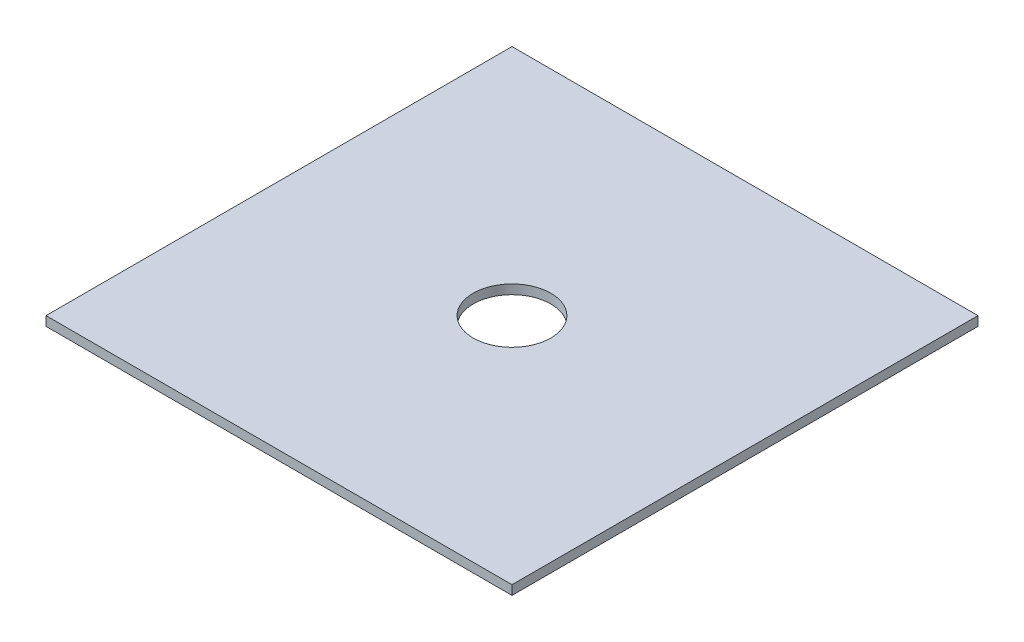
ISO-10303-21;
HEADER;
FILE_DESCRIPTION(('STEP AP214'),'2;1');
FILE_NAME('part.step','',(''),(''),'','','');
FILE_SCHEMA(('AUTOMOTIVE_DESIGN { 1 0 10303 214 1 1 1 1 }'));
ENDSEC;
DATA;
#1=APPLICATION_CONTEXT('core data for automotive mechanical design processes');
#2=APPLICATION_PROTOCOL_DEFINITION('international standard','automotive_design',2000,#1);
#3=PRODUCT_CONTEXT('',#1,'mechanical');
#4=PRODUCT('Part','Part','',(#3));
#5=PRODUCT_RELATED_PRODUCT_CATEGORY('part','',(#4));
#6=PRODUCT_DEFINITION_FORMATION('','',#4);
#7=PRODUCT_DEFINITION_CONTEXT('part definition',#1,'design');
#8=PRODUCT_DEFINITION('design','',#6,#7);
#9=PRODUCT_DEFINITION_SHAPE('','',#8);
#10=(LENGTH_UNIT() NAMED_UNIT(*) SI_UNIT(.MILLI.,.METRE.));
#11=(NAMED_UNIT(*) PLANE_ANGLE_UNIT() SI_UNIT($,.RADIAN.));
#12=(NAMED_UNIT(*) SI_UNIT($,.STERADIAN.) SOLID_ANGLE_UNIT());
#13=UNCERTAINTY_MEASURE_WITH_UNIT(LENGTH_MEASURE(1.E-05),#10,'distance_accuracy_value','');
#14=(GEOMETRIC_REPRESENTATION_CONTEXT(3) GLOBAL_UNCERTAINTY_ASSIGNED_CONTEXT((#13)) GLOBAL_UNIT_ASSIGNED_CONTEXT((#10,
#11,#12)) REPRESENTATION_CONTEXT('',''));
#15=CARTESIAN_POINT('',(0.,0.,0.));
#16=DIRECTION('',(0.,0.,1.));
#17=DIRECTION('',(1.,0.,0.));
#18=AXIS2_PLACEMENT_3D('',#15,#16,#17);
#19=CARTESIAN_POINT('',(75.,3.,75.));
#20=DIRECTION('',(-1.,0.,0.));
#21=DIRECTION('',(0.,0.,1.));
#22=AXIS2_PLACEMENT_3D('',#19,#20,#21);
#23=PLANE('',#22);
#24=DIRECTION('',(0.,0.,-1.));
#25=VECTOR('',#24,1.);
#26=CARTESIAN_POINT('',(75.,0.,75.));
#27=LINE('',#26,#25);
#28=CARTESIAN_POINT('',(75.,0.,75.));
#29=VERTEX_POINT('',#28);
#30=CARTESIAN_POINT('',(75.,0.,-75.));
#31=VERTEX_POINT('',#30);
#32=EDGE_CURVE('E96',#29,#31,#27,.T.);
#33=ORIENTED_EDGE('',*,*,#32,.T.);
#34=DIRECTION('',(0.,-1.,0.));
#35=VECTOR('',#34,1.);
#36=CARTESIAN_POINT('',(75.,3.,-75.));
#37=LINE('',#36,#35);
#38=CARTESIAN_POINT('',(75.,3.,-75.));
#39=VERTEX_POINT('',#38);
#40=EDGE_CURVE('E11',#39,#31,#37,.T.);
#41=ORIENTED_EDGE('',*,*,#40,.F.);
#42=DIRECTION('',(0.,0.,-1.));
#43=VECTOR('',#42,1.);
#44=CARTESIAN_POINT('',(75.,3.,75.));
#45=LINE('',#44,#43);
#46=CARTESIAN_POINT('',(75.,3.,75.));
#47=VERTEX_POINT('',#46);
#48=EDGE_CURVE('E84',#47,#39,#45,.T.);
#49=ORIENTED_EDGE('',*,*,#48,.F.);
#50=DIRECTION('',(0.,-1.,0.));
#51=VECTOR('',#50,1.);
#52=CARTESIAN_POINT('',(75.,3.,75.));
#53=LINE('',#52,#51);
#54=EDGE_CURVE('E92',#47,#29,#53,.T.);
#55=ORIENTED_EDGE('',*,*,#54,.T.);
#56=EDGE_LOOP('',(#33,#41,#49,#55));
#57=FACE_BOUND('',#56,.T.);
#58=ADVANCED_FACE('F33',(#57),#23,.F.);
#59=CARTESIAN_POINT('',(-75.,3.,-75.));
#60=DIRECTION('',(0.,0.,1.));
#61=DIRECTION('',(1.,0.,0.));
#62=AXIS2_PLACEMENT_3D('',#59,#60,#61);
#63=PLANE('',#62);
#64=DIRECTION('',(-1.,0.,0.));
#65=VECTOR('',#64,1.);
#66=CARTESIAN_POINT('',(-75.,0.,-75.));
#67=LINE('',#66,#65);
#68=CARTESIAN_POINT('',(-75.,0.,-75.));
#69=VERTEX_POINT('',#68);
#70=EDGE_CURVE('E88',#31,#69,#67,.T.);
#71=ORIENTED_EDGE('',*,*,#70,.T.);
#72=DIRECTION('',(0.,-1.,0.));
#73=VECTOR('',#72,1.);
#74=CARTESIAN_POINT('',(-75.,3.,-75.));
#75=LINE('',#74,#73);
#76=CARTESIAN_POINT('',(-75.,3.,-75.));
#77=VERTEX_POINT('',#76);
#78=EDGE_CURVE('E41',#77,#69,#75,.T.);
#79=ORIENTED_EDGE('',*,*,#78,.F.);
#80=DIRECTION('',(-1.,0.,0.));
#81=VECTOR('',#80,1.);
#82=CARTESIAN_POINT('',(-75.,3.,-75.));
#83=LINE('',#82,#81);
#84=EDGE_CURVE('E79',#39,#77,#83,.T.);
#85=ORIENTED_EDGE('',*,*,#84,.F.);
#86=ORIENTED_EDGE('',*,*,#40,.T.);
#87=EDGE_LOOP('',(#71,#79,#85,#86));
#88=FACE_BOUND('',#87,.T.);
#89=ADVANCED_FACE('F87',(#88),#63,.F.);
#90=CARTESIAN_POINT('',(-75.,3.,75.));
#91=DIRECTION('',(1.,0.,0.));
#92=DIRECTION('',(0.,0.,-1.));
#93=AXIS2_PLACEMENT_3D('',#90,#91,#92);
#94=PLANE('',#93);
#95=DIRECTION('',(0.,0.,1.));
#96=VECTOR('',#95,1.);
#97=CARTESIAN_POINT('',(-75.,0.,75.));
#98=LINE('',#97,#96);
#99=CARTESIAN_POINT('',(-75.,0.,75.));
#100=VERTEX_POINT('',#99);
#101=EDGE_CURVE('E66',#69,#100,#98,.T.);
#102=ORIENTED_EDGE('',*,*,#101,.T.);
#103=DIRECTION('',(0.,-1.,0.));
#104=VECTOR('',#103,1.);
#105=CARTESIAN_POINT('',(-75.,3.,75.));
#106=LINE('',#105,#104);
#107=CARTESIAN_POINT('',(-75.,3.,75.));
#108=VERTEX_POINT('',#107);
#109=EDGE_CURVE('E89',#108,#100,#106,.T.);
#110=ORIENTED_EDGE('',*,*,#109,.F.);
#111=DIRECTION('',(0.,0.,1.));
#112=VECTOR('',#111,1.);
#113=CARTESIAN_POINT('',(-75.,3.,75.));
#114=LINE('',#113,#112);
#115=EDGE_CURVE('E82',#77,#108,#114,.T.);
#116=ORIENTED_EDGE('',*,*,#115,.F.);
#117=ORIENTED_EDGE('',*,*,#78,.T.);
#118=EDGE_LOOP('',(#102,#110,#116,#117));
#119=FACE_BOUND('',#118,.T.);
#120=ADVANCED_FACE('F90',(#119),#94,.F.);
#121=CARTESIAN_POINT('',(-75.,3.,75.));
#122=DIRECTION('',(0.,0.,-1.));
#123=DIRECTION('',(-1.,0.,0.));
#124=AXIS2_PLACEMENT_3D('',#121,#122,#123);
#125=PLANE('',#124);
#126=DIRECTION('',(1.,0.,0.));
#127=VECTOR('',#126,1.);
#128=CARTESIAN_POINT('',(-75.,0.,75.));
#129=LINE('',#128,#127);
#130=EDGE_CURVE('E72',#100,#29,#129,.T.);
#131=ORIENTED_EDGE('',*,*,#130,.T.);
#132=ORIENTED_EDGE('',*,*,#54,.F.);
#133=DIRECTION('',(1.,0.,0.));
#134=VECTOR('',#133,1.);
#135=CARTESIAN_POINT('',(-75.,3.,75.));
#136=LINE('',#135,#134);
#137=EDGE_CURVE('E49',#108,#47,#136,.T.);
#138=ORIENTED_EDGE('',*,*,#137,.F.);
#139=ORIENTED_EDGE('',*,*,#109,.T.);
#140=EDGE_LOOP('',(#131,#132,#138,#139));
#141=FACE_BOUND('',#140,.T.);
#142=ADVANCED_FACE('F104',(#141),#125,.F.);
#143=CARTESIAN_POINT('',(0.,3.,0.));
#144=DIRECTION('',(0.,-1.,0.));
#145=DIRECTION('',(0.,0.,-1.));
#146=AXIS2_PLACEMENT_3D('',#143,#144,#145);
#147=PLANE('',#146);
#148=CARTESIAN_POINT('',(0.,3.,0.));
#149=DIRECTION('',(0.,1.,0.));
#150=DIRECTION('',(0.,0.,1.));
#151=AXIS2_PLACEMENT_3D('',#148,#149,#150);
#152=CIRCLE('',#151,12.5);
#153=CARTESIAN_POINT('',(0.,3.,12.5));
#154=VERTEX_POINT('',#153);
#155=EDGE_CURVE('E110',#154,#154,#152,.T.);
#156=ORIENTED_EDGE('',*,*,#155,.F.);
#157=EDGE_LOOP('',(#156));
#158=FACE_BOUND('',#157,.T.);
#159=ORIENTED_EDGE('',*,*,#48,.T.);
#160=ORIENTED_EDGE('',*,*,#84,.T.);
#161=ORIENTED_EDGE('',*,*,#115,.T.);
#162=ORIENTED_EDGE('',*,*,#137,.T.);
#163=EDGE_LOOP('',(#159,#160,#161,#162));
#164=FACE_BOUND('',#163,.T.);
#165=ADVANCED_FACE('F80',(#158,#164),#147,.F.);
#166=CARTESIAN_POINT('',(0.,0.,0.));
#167=DIRECTION('',(0.,-1.,0.));
#168=DIRECTION('',(0.,0.,-1.));
#169=AXIS2_PLACEMENT_3D('',#166,#167,#168);
#170=PLANE('',#169);
#171=CARTESIAN_POINT('',(0.,0.,0.));
#172=DIRECTION('',(0.,1.,0.));
#173=DIRECTION('',(0.,0.,1.));
#174=AXIS2_PLACEMENT_3D('',#171,#172,#173);
#175=CIRCLE('',#174,12.5);
#176=CARTESIAN_POINT('',(0.,0.,12.5));
#177=VERTEX_POINT('',#176);
#178=EDGE_CURVE('E99',#177,#177,#175,.T.);
#179=ORIENTED_EDGE('',*,*,#178,.T.);
#180=EDGE_LOOP('',(#179));
#181=FACE_BOUND('',#180,.T.);
#182=ORIENTED_EDGE('',*,*,#32,.F.);
#183=ORIENTED_EDGE('',*,*,#130,.F.);
#184=ORIENTED_EDGE('',*,*,#101,.F.);
#185=ORIENTED_EDGE('',*,*,#70,.F.);
#186=EDGE_LOOP('',(#182,#183,#184,#185));
#187=FACE_BOUND('',#186,.T.);
#188=ADVANCED_FACE('F107',(#181,#187),#170,.T.);
#189=CARTESIAN_POINT('',(0.,0.,0.));
#190=DIRECTION('',(0.,1.,0.));
#191=DIRECTION('',(0.,0.,1.));
#192=AXIS2_PLACEMENT_3D('',#189,#190,#191);
#193=CYLINDRICAL_SURFACE('',#192,12.5);
#194=ORIENTED_EDGE('',*,*,#178,.F.);
#195=EDGE_LOOP('',(#194));
#196=FACE_BOUND('',#195,.T.);
#197=ORIENTED_EDGE('',*,*,#155,.T.);
#198=EDGE_LOOP('',(#197));
#199=FACE_BOUND('',#198,.T.);
#200=ADVANCED_FACE('F117',(#196,#199),#193,.F.);
#201=CLOSED_SHELL('',(#58,#89,#120,#142,#165,#188,#200));
#202=MANIFOLD_SOLID_BREP('B2',#201);
#203=ADVANCED_BREP_SHAPE_REPRESENTATION('',(#18,#202),#14);
#204=SHAPE_DEFINITION_REPRESENTATION(#9,#203);
ENDSEC;
END-ISO-10303-21;
